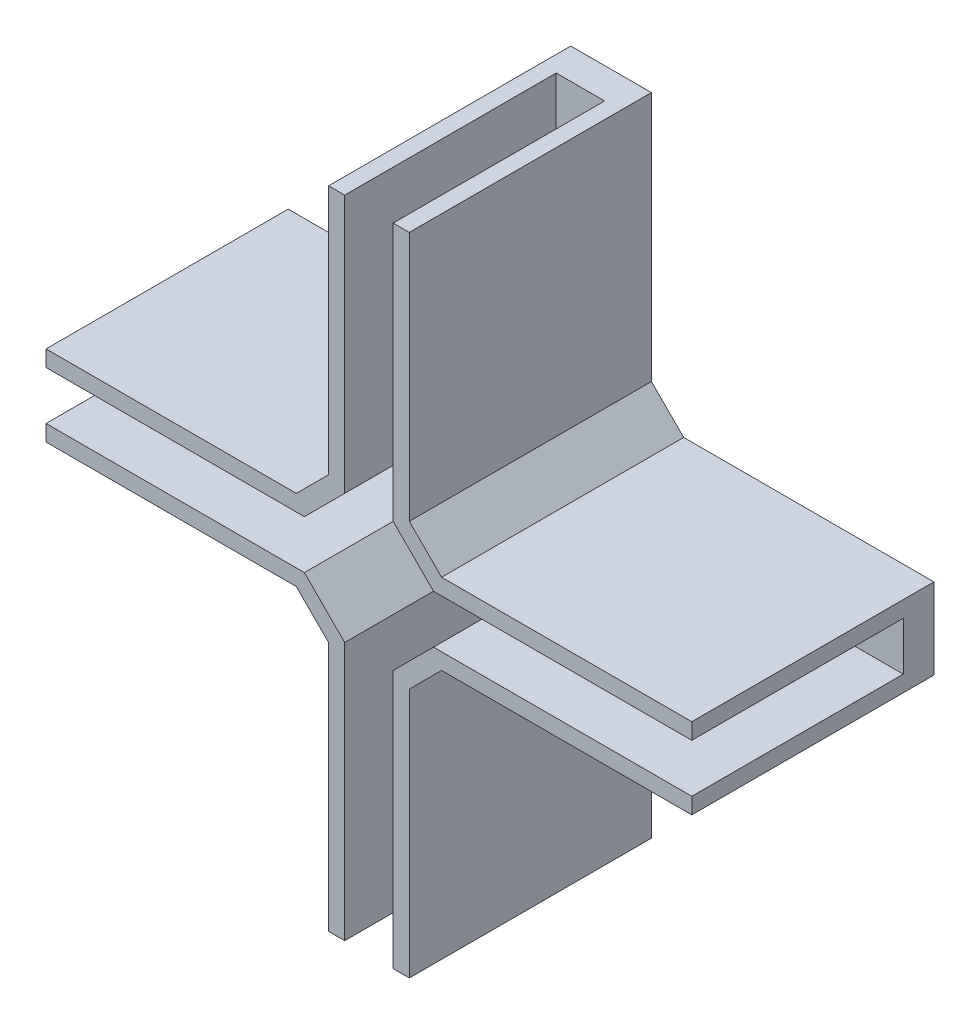
ISO-10303-21;
HEADER;
FILE_DESCRIPTION(('STEP AP214'),'2;1');
FILE_NAME('part.step','',(''),(''),'','','');
FILE_SCHEMA(('AUTOMOTIVE_DESIGN { 1 0 10303 214 1 1 1 1 }'));
ENDSEC;
DATA;
#1=APPLICATION_CONTEXT('core data for automotive mechanical design processes');
#2=APPLICATION_PROTOCOL_DEFINITION('international standard','automotive_design',2000,#1);
#3=PRODUCT_CONTEXT('',#1,'mechanical');
#4=PRODUCT('Part','Part','',(#3));
#5=PRODUCT_RELATED_PRODUCT_CATEGORY('part','',(#4));
#6=PRODUCT_DEFINITION_FORMATION('','',#4);
#7=PRODUCT_DEFINITION_CONTEXT('part definition',#1,'design');
#8=PRODUCT_DEFINITION('design','',#6,#7);
#9=PRODUCT_DEFINITION_SHAPE('','',#8);
#10=(LENGTH_UNIT() NAMED_UNIT(*) SI_UNIT(.MILLI.,.METRE.));
#11=(NAMED_UNIT(*) PLANE_ANGLE_UNIT() SI_UNIT($,.RADIAN.));
#12=(NAMED_UNIT(*) SI_UNIT($,.STERADIAN.) SOLID_ANGLE_UNIT());
#13=UNCERTAINTY_MEASURE_WITH_UNIT(LENGTH_MEASURE(1.E-05),#10,'distance_accuracy_value','');
#14=(GEOMETRIC_REPRESENTATION_CONTEXT(3) GLOBAL_UNCERTAINTY_ASSIGNED_CONTEXT((#13)) GLOBAL_UNIT_ASSIGNED_CONTEXT((#10,
#11,#12)) REPRESENTATION_CONTEXT('',''));
#15=CARTESIAN_POINT('',(0.,0.,0.));
#16=DIRECTION('',(0.,0.,1.));
#17=DIRECTION('',(1.,0.,0.));
#18=AXIS2_PLACEMENT_3D('',#15,#16,#17);
#19=CARTESIAN_POINT('',(20.,0.,15.));
#20=DIRECTION('',(-1.,0.,0.));
#21=DIRECTION('',(0.,0.,1.));
#22=AXIS2_PLACEMENT_3D('',#19,#20,#21);
#23=PLANE('',#22);
#24=DIRECTION('',(0.,0.,1.));
#25=VECTOR('',#24,1.);
#26=CARTESIAN_POINT('',(20.,-1.5,1.9));
#27=LINE('',#26,#25);
#28=CARTESIAN_POINT('',(20.,-1.5,1.9));
#29=VERTEX_POINT('',#28);
#30=CARTESIAN_POINT('',(20.,-1.5,15.));
#31=VERTEX_POINT('',#30);
#32=EDGE_CURVE('E390',#29,#31,#27,.T.);
#33=ORIENTED_EDGE('',*,*,#32,.T.);
#34=DIRECTION('',(0.,1.,0.));
#35=VECTOR('',#34,1.);
#36=CARTESIAN_POINT('',(20.,0.,15.));
#37=LINE('',#36,#35);
#38=CARTESIAN_POINT('',(20.,-2.49999999999999,15.));
#39=VERTEX_POINT('',#38);
#40=EDGE_CURVE('E346',#39,#31,#37,.T.);
#41=ORIENTED_EDGE('',*,*,#40,.F.);
#42=DIRECTION('',(0.,0.,-1.));
#43=VECTOR('',#42,1.);
#44=CARTESIAN_POINT('',(20.,-2.49999999999999,15.));
#45=LINE('',#44,#43);
#46=CARTESIAN_POINT('',(20.,-2.49999999999999,0.));
#47=VERTEX_POINT('',#46);
#48=EDGE_CURVE('E457',#39,#47,#45,.T.);
#49=ORIENTED_EDGE('',*,*,#48,.T.);
#50=DIRECTION('',(0.,1.,0.));
#51=VECTOR('',#50,1.);
#52=CARTESIAN_POINT('',(20.,0.,0.));
#53=LINE('',#52,#51);
#54=CARTESIAN_POINT('',(20.,2.50000000000001,0.));
#55=VERTEX_POINT('',#54);
#56=EDGE_CURVE('E394',#47,#55,#53,.T.);
#57=ORIENTED_EDGE('',*,*,#56,.T.);
#58=DIRECTION('',(0.,0.,-1.));
#59=VECTOR('',#58,1.);
#60=CARTESIAN_POINT('',(20.,2.50000000000001,15.));
#61=LINE('',#60,#59);
#62=CARTESIAN_POINT('',(20.,2.50000000000001,15.));
#63=VERTEX_POINT('',#62);
#64=EDGE_CURVE('E455',#63,#55,#61,.T.);
#65=ORIENTED_EDGE('',*,*,#64,.F.);
#66=CARTESIAN_POINT('',(20.,1.5,15.));
#67=VERTEX_POINT('',#66);
#68=EDGE_CURVE('E295',#67,#63,#37,.T.);
#69=ORIENTED_EDGE('',*,*,#68,.F.);
#70=DIRECTION('',(0.,0.,1.));
#71=VECTOR('',#70,1.);
#72=CARTESIAN_POINT('',(20.,1.5,1.9));
#73=LINE('',#72,#71);
#74=CARTESIAN_POINT('',(20.,1.5,1.9));
#75=VERTEX_POINT('',#74);
#76=EDGE_CURVE('E273',#75,#67,#73,.T.);
#77=ORIENTED_EDGE('',*,*,#76,.F.);
#78=DIRECTION('',(0.,1.,0.));
#79=VECTOR('',#78,1.);
#80=CARTESIAN_POINT('',(20.,-1.5,1.9));
#81=LINE('',#80,#79);
#82=EDGE_CURVE('E284',#29,#75,#81,.T.);
#83=ORIENTED_EDGE('',*,*,#82,.F.);
#84=EDGE_LOOP('',(#33,#41,#49,#57,#65,#69,#77,#83));
#85=FACE_BOUND('',#84,.T.);
#86=ADVANCED_FACE('F61',(#85),#23,.F.);
#87=CARTESIAN_POINT('',(-20.,0.,15.));
#88=DIRECTION('',(-1.,0.,0.));
#89=DIRECTION('',(0.,0.,1.));
#90=AXIS2_PLACEMENT_3D('',#87,#88,#89);
#91=PLANE('',#90);
#92=DIRECTION('',(0.,1.,0.));
#93=VECTOR('',#92,1.);
#94=CARTESIAN_POINT('',(-20.,0.,15.));
#95=LINE('',#94,#93);
#96=CARTESIAN_POINT('',(-20.,-2.49999999999999,15.));
#97=VERTEX_POINT('',#96);
#98=CARTESIAN_POINT('',(-20.,-1.5,15.));
#99=VERTEX_POINT('',#98);
#100=EDGE_CURVE('E371',#97,#99,#95,.T.);
#101=ORIENTED_EDGE('',*,*,#100,.T.);
#102=DIRECTION('',(0.,0.,1.));
#103=VECTOR('',#102,1.);
#104=CARTESIAN_POINT('',(-20.,-1.5,1.9));
#105=LINE('',#104,#103);
#106=CARTESIAN_POINT('',(-20.,-1.5,1.9));
#107=VERTEX_POINT('',#106);
#108=EDGE_CURVE('E299',#107,#99,#105,.T.);
#109=ORIENTED_EDGE('',*,*,#108,.F.);
#110=DIRECTION('',(0.,1.,0.));
#111=VECTOR('',#110,1.);
#112=CARTESIAN_POINT('',(-20.,-1.5,1.9));
#113=LINE('',#112,#111);
#114=CARTESIAN_POINT('',(-20.,1.5,1.9));
#115=VERTEX_POINT('',#114);
#116=EDGE_CURVE('E279',#107,#115,#113,.T.);
#117=ORIENTED_EDGE('',*,*,#116,.T.);
#118=DIRECTION('',(0.,0.,1.));
#119=VECTOR('',#118,1.);
#120=CARTESIAN_POINT('',(-20.,1.5,1.9));
#121=LINE('',#120,#119);
#122=CARTESIAN_POINT('',(-20.,1.5,15.));
#123=VERTEX_POINT('',#122);
#124=EDGE_CURVE('E296',#115,#123,#121,.T.);
#125=ORIENTED_EDGE('',*,*,#124,.T.);
#126=CARTESIAN_POINT('',(-20.,2.50000000000001,15.));
#127=VERTEX_POINT('',#126);
#128=EDGE_CURVE('E370',#123,#127,#95,.T.);
#129=ORIENTED_EDGE('',*,*,#128,.T.);
#130=DIRECTION('',(0.,0.,-1.));
#131=VECTOR('',#130,1.);
#132=CARTESIAN_POINT('',(-20.,2.50000000000001,15.));
#133=LINE('',#132,#131);
#134=CARTESIAN_POINT('',(-20.,2.50000000000001,0.));
#135=VERTEX_POINT('',#134);
#136=EDGE_CURVE('E440',#127,#135,#133,.T.);
#137=ORIENTED_EDGE('',*,*,#136,.T.);
#138=DIRECTION('',(0.,1.,0.));
#139=VECTOR('',#138,1.);
#140=CARTESIAN_POINT('',(-20.,0.,0.));
#141=LINE('',#140,#139);
#142=CARTESIAN_POINT('',(-20.,-2.49999999999999,0.));
#143=VERTEX_POINT('',#142);
#144=EDGE_CURVE('E417',#143,#135,#141,.T.);
#145=ORIENTED_EDGE('',*,*,#144,.F.);
#146=DIRECTION('',(0.,0.,-1.));
#147=VECTOR('',#146,1.);
#148=CARTESIAN_POINT('',(-20.,-2.49999999999999,15.));
#149=LINE('',#148,#147);
#150=EDGE_CURVE('E438',#97,#143,#149,.T.);
#151=ORIENTED_EDGE('',*,*,#150,.F.);
#152=EDGE_LOOP('',(#101,#109,#117,#125,#129,#137,#145,#151));
#153=FACE_BOUND('',#152,.T.);
#154=ADVANCED_FACE('F533',(#153),#91,.T.);
#155=CARTESIAN_POINT('',(0.,0.,15.));
#156=DIRECTION('',(0.,0.,1.));
#157=DIRECTION('',(1.,0.,0.));
#158=AXIS2_PLACEMENT_3D('',#155,#156,#157);
#159=PLANE('',#158);
#160=DIRECTION('',(-1.,0.,0.));
#161=VECTOR('',#160,1.);
#162=CARTESIAN_POINT('',(20.,1.5,15.));
#163=LINE('',#162,#161);
#164=CARTESIAN_POINT('',(-3.99999999999999,1.5,15.));
#165=VERTEX_POINT('',#164);
#166=EDGE_CURVE('E337',#165,#123,#163,.T.);
#167=ORIENTED_EDGE('',*,*,#166,.F.);
#168=DIRECTION('',(-0.707106781186546,-0.707106781186549,0.));
#169=VECTOR('',#168,1.);
#170=CARTESIAN_POINT('',(-2.75,2.74999999999999,15.));
#171=LINE('',#170,#169);
#172=CARTESIAN_POINT('',(-1.5,4.,15.));
#173=VERTEX_POINT('',#172);
#174=EDGE_CURVE('E482',#165,#173,#171,.F.);
#175=ORIENTED_EDGE('',*,*,#174,.T.);
#176=DIRECTION('',(0.,-1.,0.));
#177=VECTOR('',#176,1.);
#178=CARTESIAN_POINT('',(-1.5,20.,15.));
#179=LINE('',#178,#177);
#180=CARTESIAN_POINT('',(-1.5,20.,15.));
#181=VERTEX_POINT('',#180);
#182=EDGE_CURVE('E309',#181,#173,#179,.T.);
#183=ORIENTED_EDGE('',*,*,#182,.F.);
#184=DIRECTION('',(1.,0.,0.));
#185=VECTOR('',#184,1.);
#186=CARTESIAN_POINT('',(0.,20.,15.));
#187=LINE('',#186,#185);
#188=CARTESIAN_POINT('',(-2.5,20.,15.));
#189=VERTEX_POINT('',#188);
#190=EDGE_CURVE('E358',#189,#181,#187,.T.);
#191=ORIENTED_EDGE('',*,*,#190,.F.);
#192=DIRECTION('',(0.,1.,0.));
#193=VECTOR('',#192,1.);
#194=CARTESIAN_POINT('',(-2.5,0.,15.));
#195=LINE('',#194,#193);
#196=CARTESIAN_POINT('',(-2.5,4.50000000000001,15.));
#197=VERTEX_POINT('',#196);
#198=EDGE_CURVE('E361',#197,#189,#195,.T.);
#199=ORIENTED_EDGE('',*,*,#198,.F.);
#200=DIRECTION('',(0.707106781186548,0.707106781186547,0.));
#201=VECTOR('',#200,1.);
#202=CARTESIAN_POINT('',(-3.50000000000001,3.50000000000001,15.));
#203=LINE('',#202,#201);
#204=CARTESIAN_POINT('',(-4.5,2.50000000000001,15.));
#205=VERTEX_POINT('',#204);
#206=EDGE_CURVE('E364',#205,#197,#203,.T.);
#207=ORIENTED_EDGE('',*,*,#206,.F.);
#208=DIRECTION('',(1.,0.,0.));
#209=VECTOR('',#208,1.);
#210=CARTESIAN_POINT('',(0.,2.50000000000001,15.));
#211=LINE('',#210,#209);
#212=EDGE_CURVE('E367',#127,#205,#211,.T.);
#213=ORIENTED_EDGE('',*,*,#212,.F.);
#214=ORIENTED_EDGE('',*,*,#128,.F.);
#215=EDGE_LOOP('',(#167,#175,#183,#191,#199,#207,#213,#214));
#216=FACE_BOUND('',#215,.T.);
#217=ADVANCED_FACE('F509',(#216),#159,.T.);
#218=CARTESIAN_POINT('',(-1.5,-3.99999999999999,15.));
#219=VERTEX_POINT('',#218);
#220=CARTESIAN_POINT('',(-1.5,-20.,15.));
#221=VERTEX_POINT('',#220);
#222=EDGE_CURVE('E323',#219,#221,#179,.T.);
#223=ORIENTED_EDGE('',*,*,#222,.F.);
#224=DIRECTION('',(-0.70710678118655,0.707106781186546,0.));
#225=VECTOR('',#224,1.);
#226=CARTESIAN_POINT('',(-2.74999999999999,-2.75000000000001,15.));
#227=LINE('',#226,#225);
#228=CARTESIAN_POINT('',(-4.00000000000001,-1.5,15.));
#229=VERTEX_POINT('',#228);
#230=EDGE_CURVE('E84',#219,#229,#227,.T.);
#231=ORIENTED_EDGE('',*,*,#230,.T.);
#232=DIRECTION('',(-1.,0.,0.));
#233=VECTOR('',#232,1.);
#234=CARTESIAN_POINT('',(20.,-1.5,15.));
#235=LINE('',#234,#233);
#236=EDGE_CURVE('E540',#229,#99,#235,.T.);
#237=ORIENTED_EDGE('',*,*,#236,.T.);
#238=ORIENTED_EDGE('',*,*,#100,.F.);
#239=DIRECTION('',(1.,0.,0.));
#240=VECTOR('',#239,1.);
#241=CARTESIAN_POINT('',(0.,-2.49999999999999,15.));
#242=LINE('',#241,#240);
#243=CARTESIAN_POINT('',(-4.5,-2.49999999999999,15.));
#244=VERTEX_POINT('',#243);
#245=EDGE_CURVE('E374',#97,#244,#242,.T.);
#246=ORIENTED_EDGE('',*,*,#245,.T.);
#247=DIRECTION('',(0.707106781186548,-0.707106781186547,0.));
#248=VECTOR('',#247,1.);
#249=CARTESIAN_POINT('',(-3.5,-3.5,15.));
#250=LINE('',#249,#248);
#251=CARTESIAN_POINT('',(-2.5,-4.49999999999999,15.));
#252=VERTEX_POINT('',#251);
#253=EDGE_CURVE('E376',#244,#252,#250,.T.);
#254=ORIENTED_EDGE('',*,*,#253,.T.);
#255=DIRECTION('',(0.,1.,0.));
#256=VECTOR('',#255,1.);
#257=CARTESIAN_POINT('',(-2.5,0.,15.));
#258=LINE('',#257,#256);
#259=CARTESIAN_POINT('',(-2.5,-20.,15.));
#260=VERTEX_POINT('',#259);
#261=EDGE_CURVE('E378',#260,#252,#258,.T.);
#262=ORIENTED_EDGE('',*,*,#261,.F.);
#263=DIRECTION('',(1.,0.,0.));
#264=VECTOR('',#263,1.);
#265=CARTESIAN_POINT('',(0.,-20.,15.));
#266=LINE('',#265,#264);
#267=EDGE_CURVE('E382',#260,#221,#266,.T.);
#268=ORIENTED_EDGE('',*,*,#267,.T.);
#269=EDGE_LOOP('',(#223,#231,#237,#238,#246,#254,#262,#268));
#270=FACE_BOUND('',#269,.T.);
#271=ADVANCED_FACE('F546',(#270),#159,.T.);
#272=CARTESIAN_POINT('',(4.00000000000002,-1.5,15.));
#273=VERTEX_POINT('',#272);
#274=EDGE_CURVE('E291',#31,#273,#235,.T.);
#275=ORIENTED_EDGE('',*,*,#274,.T.);
#276=DIRECTION('',(0.707106781186547,0.707106781186548,0.));
#277=VECTOR('',#276,1.);
#278=CARTESIAN_POINT('',(2.75000000000001,-2.75,15.));
#279=LINE('',#278,#277);
#280=CARTESIAN_POINT('',(1.5,-4.00000000000001,15.));
#281=VERTEX_POINT('',#280);
#282=EDGE_CURVE('E469',#273,#281,#279,.F.);
#283=ORIENTED_EDGE('',*,*,#282,.T.);
#284=DIRECTION('',(0.,-1.,0.));
#285=VECTOR('',#284,1.);
#286=CARTESIAN_POINT('',(1.5,20.,15.));
#287=LINE('',#286,#285);
#288=CARTESIAN_POINT('',(1.5,-20.,15.));
#289=VERTEX_POINT('',#288);
#290=EDGE_CURVE('E324',#281,#289,#287,.T.);
#291=ORIENTED_EDGE('',*,*,#290,.T.);
#292=CARTESIAN_POINT('',(2.5,-20.,15.));
#293=VERTEX_POINT('',#292);
#294=EDGE_CURVE('E381',#289,#293,#266,.T.);
#295=ORIENTED_EDGE('',*,*,#294,.T.);
#296=DIRECTION('',(0.,1.,0.));
#297=VECTOR('',#296,1.);
#298=CARTESIAN_POINT('',(2.5,0.,15.));
#299=LINE('',#298,#297);
#300=CARTESIAN_POINT('',(2.5,-4.49999999999999,15.));
#301=VERTEX_POINT('',#300);
#302=EDGE_CURVE('E338',#293,#301,#299,.T.);
#303=ORIENTED_EDGE('',*,*,#302,.T.);
#304=DIRECTION('',(0.707106781186547,0.707106781186548,0.));
#305=VECTOR('',#304,1.);
#306=CARTESIAN_POINT('',(3.5,-3.49999999999999,15.));
#307=LINE('',#306,#305);
#308=CARTESIAN_POINT('',(4.5,-2.49999999999999,15.));
#309=VERTEX_POINT('',#308);
#310=EDGE_CURVE('E341',#301,#309,#307,.T.);
#311=ORIENTED_EDGE('',*,*,#310,.T.);
#312=DIRECTION('',(1.,0.,0.));
#313=VECTOR('',#312,1.);
#314=CARTESIAN_POINT('',(0.,-2.49999999999999,15.));
#315=LINE('',#314,#313);
#316=EDGE_CURVE('E344',#309,#39,#315,.T.);
#317=ORIENTED_EDGE('',*,*,#316,.T.);
#318=ORIENTED_EDGE('',*,*,#40,.T.);
#319=EDGE_LOOP('',(#275,#283,#291,#295,#303,#311,#317,#318));
#320=FACE_BOUND('',#319,.T.);
#321=ADVANCED_FACE('F588',(#320),#159,.T.);
#322=CARTESIAN_POINT('',(2.5,0.,15.));
#323=DIRECTION('',(-1.,0.,0.));
#324=DIRECTION('',(0.,-1.,0.));
#325=AXIS2_PLACEMENT_3D('',#322,#323,#324);
#326=PLANE('',#325);
#327=DIRECTION('',(0.,1.,0.));
#328=VECTOR('',#327,1.);
#329=CARTESIAN_POINT('',(2.5,0.,0.));
#330=LINE('',#329,#328);
#331=CARTESIAN_POINT('',(2.5,-20.,0.));
#332=VERTEX_POINT('',#331);
#333=CARTESIAN_POINT('',(2.5,-4.49999999999999,0.));
#334=VERTEX_POINT('',#333);
#335=EDGE_CURVE('E386',#332,#334,#330,.T.);
#336=ORIENTED_EDGE('',*,*,#335,.T.);
#337=DIRECTION('',(0.,0.,-1.));
#338=VECTOR('',#337,1.);
#339=CARTESIAN_POINT('',(2.5,-4.49999999999999,15.));
#340=LINE('',#339,#338);
#341=EDGE_CURVE('E463',#301,#334,#340,.T.);
#342=ORIENTED_EDGE('',*,*,#341,.F.);
#343=ORIENTED_EDGE('',*,*,#302,.F.);
#344=DIRECTION('',(0.,0.,-1.));
#345=VECTOR('',#344,1.);
#346=CARTESIAN_POINT('',(2.5,-20.,15.));
#347=LINE('',#346,#345);
#348=EDGE_CURVE('E385',#293,#332,#347,.T.);
#349=ORIENTED_EDGE('',*,*,#348,.T.);
#350=EDGE_LOOP('',(#336,#342,#343,#349));
#351=FACE_BOUND('',#350,.T.);
#352=ADVANCED_FACE('F622',(#351),#326,.F.);
#353=CARTESIAN_POINT('',(3.5,-3.49999999999999,15.));
#354=DIRECTION('',(-0.707106781186548,0.707106781186547,0.));
#355=DIRECTION('',(-0.707106781186547,-0.707106781186548,0.));
#356=AXIS2_PLACEMENT_3D('',#353,#354,#355);
#357=PLANE('',#356);
#358=DIRECTION('',(0.707106781186547,0.707106781186548,0.));
#359=VECTOR('',#358,1.);
#360=CARTESIAN_POINT('',(3.5,-3.49999999999999,0.));
#361=LINE('',#360,#359);
#362=CARTESIAN_POINT('',(4.5,-2.49999999999999,0.));
#363=VERTEX_POINT('',#362);
#364=EDGE_CURVE('E389',#334,#363,#361,.T.);
#365=ORIENTED_EDGE('',*,*,#364,.T.);
#366=DIRECTION('',(0.,0.,-1.));
#367=VECTOR('',#366,1.);
#368=CARTESIAN_POINT('',(4.5,-2.49999999999999,15.));
#369=LINE('',#368,#367);
#370=EDGE_CURVE('E460',#309,#363,#369,.T.);
#371=ORIENTED_EDGE('',*,*,#370,.F.);
#372=ORIENTED_EDGE('',*,*,#310,.F.);
#373=ORIENTED_EDGE('',*,*,#341,.T.);
#374=EDGE_LOOP('',(#365,#371,#372,#373));
#375=FACE_BOUND('',#374,.T.);
#376=ADVANCED_FACE('F625',(#375),#357,.F.);
#377=CARTESIAN_POINT('',(0.,-2.49999999999999,15.));
#378=DIRECTION('',(0.,1.,0.));
#379=DIRECTION('',(0.,0.,1.));
#380=AXIS2_PLACEMENT_3D('',#377,#378,#379);
#381=PLANE('',#380);
#382=DIRECTION('',(1.,0.,0.));
#383=VECTOR('',#382,1.);
#384=CARTESIAN_POINT('',(0.,-2.49999999999999,0.));
#385=LINE('',#384,#383);
#386=EDGE_CURVE('E392',#363,#47,#385,.T.);
#387=ORIENTED_EDGE('',*,*,#386,.T.);
#388=ORIENTED_EDGE('',*,*,#48,.F.);
#389=ORIENTED_EDGE('',*,*,#316,.F.);
#390=ORIENTED_EDGE('',*,*,#370,.T.);
#391=EDGE_LOOP('',(#387,#388,#389,#390));
#392=FACE_BOUND('',#391,.T.);
#393=ADVANCED_FACE('F593',(#392),#381,.F.);
#394=CARTESIAN_POINT('',(0.,2.50000000000001,15.));
#395=DIRECTION('',(0.,1.,0.));
#396=DIRECTION('',(0.,0.,1.));
#397=AXIS2_PLACEMENT_3D('',#394,#395,#396);
#398=PLANE('',#397);
#399=DIRECTION('',(1.,0.,0.));
#400=VECTOR('',#399,1.);
#401=CARTESIAN_POINT('',(0.,2.50000000000001,0.));
#402=LINE('',#401,#400);
#403=CARTESIAN_POINT('',(4.5,2.50000000000001,0.));
#404=VERTEX_POINT('',#403);
#405=EDGE_CURVE('E397',#404,#55,#402,.T.);
#406=ORIENTED_EDGE('',*,*,#405,.F.);
#407=DIRECTION('',(0.,0.,-1.));
#408=VECTOR('',#407,1.);
#409=CARTESIAN_POINT('',(4.5,2.50000000000001,15.));
#410=LINE('',#409,#408);
#411=CARTESIAN_POINT('',(4.5,2.50000000000001,15.));
#412=VERTEX_POINT('',#411);
#413=EDGE_CURVE('E453',#412,#404,#410,.T.);
#414=ORIENTED_EDGE('',*,*,#413,.F.);
#415=DIRECTION('',(1.,0.,0.));
#416=VECTOR('',#415,1.);
#417=CARTESIAN_POINT('',(0.,2.50000000000001,15.));
#418=LINE('',#417,#416);
#419=EDGE_CURVE('E349',#412,#63,#418,.T.);
#420=ORIENTED_EDGE('',*,*,#419,.T.);
#421=ORIENTED_EDGE('',*,*,#64,.T.);
#422=EDGE_LOOP('',(#406,#414,#420,#421));
#423=FACE_BOUND('',#422,.T.);
#424=ADVANCED_FACE('F603',(#423),#398,.T.);
#425=CARTESIAN_POINT('',(3.50000000000001,3.5,15.));
#426=DIRECTION('',(-0.707106781186548,-0.707106781186547,0.));
#427=DIRECTION('',(0.707106781186547,-0.707106781186548,0.));
#428=AXIS2_PLACEMENT_3D('',#425,#426,#427);
#429=PLANE('',#428);
#430=DIRECTION('',(-0.707106781186547,0.707106781186548,0.));
#431=VECTOR('',#430,1.);
#432=CARTESIAN_POINT('',(3.50000000000001,3.5,0.));
#433=LINE('',#432,#431);
#434=CARTESIAN_POINT('',(2.5,4.50000000000001,0.));
#435=VERTEX_POINT('',#434);
#436=EDGE_CURVE('E400',#404,#435,#433,.T.);
#437=ORIENTED_EDGE('',*,*,#436,.T.);
#438=DIRECTION('',(0.,0.,-1.));
#439=VECTOR('',#438,1.);
#440=CARTESIAN_POINT('',(2.5,4.50000000000001,15.));
#441=LINE('',#440,#439);
#442=CARTESIAN_POINT('',(2.5,4.50000000000001,15.));
#443=VERTEX_POINT('',#442);
#444=EDGE_CURVE('E450',#443,#435,#441,.T.);
#445=ORIENTED_EDGE('',*,*,#444,.F.);
#446=DIRECTION('',(-0.707106781186547,0.707106781186548,0.));
#447=VECTOR('',#446,1.);
#448=CARTESIAN_POINT('',(3.50000000000001,3.5,15.));
#449=LINE('',#448,#447);
#450=EDGE_CURVE('E352',#412,#443,#449,.T.);
#451=ORIENTED_EDGE('',*,*,#450,.F.);
#452=ORIENTED_EDGE('',*,*,#413,.T.);
#453=EDGE_LOOP('',(#437,#445,#451,#452));
#454=FACE_BOUND('',#453,.T.);
#455=ADVANCED_FACE('F643',(#454),#429,.F.);
#456=CARTESIAN_POINT('',(2.5,0.,15.));
#457=DIRECTION('',(-1.,0.,0.));
#458=DIRECTION('',(0.,-1.,0.));
#459=AXIS2_PLACEMENT_3D('',#456,#457,#458);
#460=PLANE('',#459);
#461=DIRECTION('',(0.,1.,0.));
#462=VECTOR('',#461,1.);
#463=CARTESIAN_POINT('',(2.5,0.,0.));
#464=LINE('',#463,#462);
#465=CARTESIAN_POINT('',(2.5,20.,0.));
#466=VERTEX_POINT('',#465);
#467=EDGE_CURVE('E402',#435,#466,#464,.T.);
#468=ORIENTED_EDGE('',*,*,#467,.T.);
#469=DIRECTION('',(0.,0.,-1.));
#470=VECTOR('',#469,1.);
#471=CARTESIAN_POINT('',(2.5,20.,15.));
#472=LINE('',#471,#470);
#473=CARTESIAN_POINT('',(2.5,20.,15.));
#474=VERTEX_POINT('',#473);
#475=EDGE_CURVE('E448',#474,#466,#472,.T.);
#476=ORIENTED_EDGE('',*,*,#475,.F.);
#477=DIRECTION('',(0.,1.,0.));
#478=VECTOR('',#477,1.);
#479=CARTESIAN_POINT('',(2.5,0.,15.));
#480=LINE('',#479,#478);
#481=EDGE_CURVE('E354',#443,#474,#480,.T.);
#482=ORIENTED_EDGE('',*,*,#481,.F.);
#483=ORIENTED_EDGE('',*,*,#444,.T.);
#484=EDGE_LOOP('',(#468,#476,#482,#483));
#485=FACE_BOUND('',#484,.T.);
#486=ADVANCED_FACE('F619',(#485),#460,.F.);
#487=CARTESIAN_POINT('',(0.,20.,15.));
#488=DIRECTION('',(0.,1.,0.));
#489=DIRECTION('',(0.,0.,1.));
#490=AXIS2_PLACEMENT_3D('',#487,#488,#489);
#491=PLANE('',#490);
#492=DIRECTION('',(0.,0.,1.));
#493=VECTOR('',#492,1.);
#494=CARTESIAN_POINT('',(-1.5,20.,1.9));
#495=LINE('',#494,#493);
#496=CARTESIAN_POINT('',(-1.5,20.,1.9));
#497=VERTEX_POINT('',#496);
#498=EDGE_CURVE('E319',#497,#181,#495,.T.);
#499=ORIENTED_EDGE('',*,*,#498,.F.);
#500=DIRECTION('',(1.,0.,0.));
#501=VECTOR('',#500,1.);
#502=CARTESIAN_POINT('',(-1.5,20.,1.9));
#503=LINE('',#502,#501);
#504=CARTESIAN_POINT('',(1.5,20.,1.9));
#505=VERTEX_POINT('',#504);
#506=EDGE_CURVE('E305',#497,#505,#503,.T.);
#507=ORIENTED_EDGE('',*,*,#506,.T.);
#508=DIRECTION('',(0.,0.,1.));
#509=VECTOR('',#508,1.);
#510=CARTESIAN_POINT('',(1.5,20.,1.9));
#511=LINE('',#510,#509);
#512=CARTESIAN_POINT('',(1.5,20.,15.));
#513=VERTEX_POINT('',#512);
#514=EDGE_CURVE('E334',#505,#513,#511,.T.);
#515=ORIENTED_EDGE('',*,*,#514,.T.);
#516=EDGE_CURVE('E357',#513,#474,#187,.T.);
#517=ORIENTED_EDGE('',*,*,#516,.T.);
#518=ORIENTED_EDGE('',*,*,#475,.T.);
#519=DIRECTION('',(1.,0.,0.));
#520=VECTOR('',#519,1.);
#521=CARTESIAN_POINT('',(0.,20.,0.));
#522=LINE('',#521,#520);
#523=CARTESIAN_POINT('',(-2.5,20.,0.));
#524=VERTEX_POINT('',#523);
#525=EDGE_CURVE('E405',#524,#466,#522,.T.);
#526=ORIENTED_EDGE('',*,*,#525,.F.);
#527=DIRECTION('',(0.,0.,-1.));
#528=VECTOR('',#527,1.);
#529=CARTESIAN_POINT('',(-2.5,20.,15.));
#530=LINE('',#529,#528);
#531=EDGE_CURVE('E446',#189,#524,#530,.T.);
#532=ORIENTED_EDGE('',*,*,#531,.F.);
#533=ORIENTED_EDGE('',*,*,#190,.T.);
#534=EDGE_LOOP('',(#499,#507,#515,#517,#518,#526,#532,#533));
#535=FACE_BOUND('',#534,.T.);
#536=ADVANCED_FACE('F516',(#535),#491,.T.);
#537=CARTESIAN_POINT('',(-2.5,0.,15.));
#538=DIRECTION('',(-1.,0.,0.));
#539=DIRECTION('',(0.,0.,1.));
#540=AXIS2_PLACEMENT_3D('',#537,#538,#539);
#541=PLANE('',#540);
#542=DIRECTION('',(0.,1.,0.));
#543=VECTOR('',#542,1.);
#544=CARTESIAN_POINT('',(-2.5,0.,0.));
#545=LINE('',#544,#543);
#546=CARTESIAN_POINT('',(-2.5,4.50000000000001,0.));
#547=VERTEX_POINT('',#546);
#548=EDGE_CURVE('E408',#547,#524,#545,.T.);
#549=ORIENTED_EDGE('',*,*,#548,.F.);
#550=DIRECTION('',(0.,0.,-1.));
#551=VECTOR('',#550,1.);
#552=CARTESIAN_POINT('',(-2.5,4.50000000000001,15.));
#553=LINE('',#552,#551);
#554=EDGE_CURVE('E444',#197,#547,#553,.T.);
#555=ORIENTED_EDGE('',*,*,#554,.F.);
#556=ORIENTED_EDGE('',*,*,#198,.T.);
#557=ORIENTED_EDGE('',*,*,#531,.T.);
#558=EDGE_LOOP('',(#549,#555,#556,#557));
#559=FACE_BOUND('',#558,.T.);
#560=ADVANCED_FACE('F522',(#559),#541,.T.);
#561=CARTESIAN_POINT('',(-3.50000000000001,3.50000000000001,15.));
#562=DIRECTION('',(-0.707106781186547,0.707106781186548,0.));
#563=DIRECTION('',(-0.707106781186548,-0.707106781186547,0.));
#564=AXIS2_PLACEMENT_3D('',#561,#562,#563);
#565=PLANE('',#564);
#566=DIRECTION('',(0.707106781186548,0.707106781186547,0.));
#567=VECTOR('',#566,1.);
#568=CARTESIAN_POINT('',(-3.50000000000001,3.50000000000001,0.));
#569=LINE('',#568,#567);
#570=CARTESIAN_POINT('',(-4.5,2.50000000000001,0.));
#571=VERTEX_POINT('',#570);
#572=EDGE_CURVE('E411',#571,#547,#569,.T.);
#573=ORIENTED_EDGE('',*,*,#572,.F.);
#574=DIRECTION('',(0.,0.,-1.));
#575=VECTOR('',#574,1.);
#576=CARTESIAN_POINT('',(-4.5,2.50000000000001,15.));
#577=LINE('',#576,#575);
#578=EDGE_CURVE('E442',#205,#571,#577,.T.);
#579=ORIENTED_EDGE('',*,*,#578,.F.);
#580=ORIENTED_EDGE('',*,*,#206,.T.);
#581=ORIENTED_EDGE('',*,*,#554,.T.);
#582=EDGE_LOOP('',(#573,#579,#580,#581));
#583=FACE_BOUND('',#582,.T.);
#584=ADVANCED_FACE('F525',(#583),#565,.T.);
#585=CARTESIAN_POINT('',(0.,2.50000000000001,15.));
#586=DIRECTION('',(0.,1.,0.));
#587=DIRECTION('',(0.,0.,1.));
#588=AXIS2_PLACEMENT_3D('',#585,#586,#587);
#589=PLANE('',#588);
#590=DIRECTION('',(1.,0.,0.));
#591=VECTOR('',#590,1.);
#592=CARTESIAN_POINT('',(0.,2.50000000000001,0.));
#593=LINE('',#592,#591);
#594=EDGE_CURVE('E414',#135,#571,#593,.T.);
#595=ORIENTED_EDGE('',*,*,#594,.F.);
#596=ORIENTED_EDGE('',*,*,#136,.F.);
#597=ORIENTED_EDGE('',*,*,#212,.T.);
#598=ORIENTED_EDGE('',*,*,#578,.T.);
#599=EDGE_LOOP('',(#595,#596,#597,#598));
#600=FACE_BOUND('',#599,.T.);
#601=ADVANCED_FACE('F530',(#600),#589,.T.);
#602=CARTESIAN_POINT('',(0.,-2.49999999999999,15.));
#603=DIRECTION('',(0.,1.,0.));
#604=DIRECTION('',(0.,0.,1.));
#605=AXIS2_PLACEMENT_3D('',#602,#603,#604);
#606=PLANE('',#605);
#607=DIRECTION('',(1.,0.,0.));
#608=VECTOR('',#607,1.);
#609=CARTESIAN_POINT('',(0.,-2.49999999999999,0.));
#610=LINE('',#609,#608);
#611=CARTESIAN_POINT('',(-4.5,-2.49999999999999,0.));
#612=VERTEX_POINT('',#611);
#613=EDGE_CURVE('E420',#143,#612,#610,.T.);
#614=ORIENTED_EDGE('',*,*,#613,.T.);
#615=DIRECTION('',(0.,0.,-1.));
#616=VECTOR('',#615,1.);
#617=CARTESIAN_POINT('',(-4.5,-2.49999999999999,15.));
#618=LINE('',#617,#616);
#619=EDGE_CURVE('E435',#244,#612,#618,.T.);
#620=ORIENTED_EDGE('',*,*,#619,.F.);
#621=ORIENTED_EDGE('',*,*,#245,.F.);
#622=ORIENTED_EDGE('',*,*,#150,.T.);
#623=EDGE_LOOP('',(#614,#620,#621,#622));
#624=FACE_BOUND('',#623,.T.);
#625=ADVANCED_FACE('F552',(#624),#606,.F.);
#626=CARTESIAN_POINT('',(-3.5,-3.5,15.));
#627=DIRECTION('',(0.707106781186547,0.707106781186548,0.));
#628=DIRECTION('',(-0.707106781186548,0.707106781186547,0.));
#629=AXIS2_PLACEMENT_3D('',#626,#627,#628);
#630=PLANE('',#629);
#631=DIRECTION('',(0.707106781186548,-0.707106781186547,0.));
#632=VECTOR('',#631,1.);
#633=CARTESIAN_POINT('',(-3.5,-3.5,0.));
#634=LINE('',#633,#632);
#635=CARTESIAN_POINT('',(-2.5,-4.49999999999999,0.));
#636=VERTEX_POINT('',#635);
#637=EDGE_CURVE('E422',#612,#636,#634,.T.);
#638=ORIENTED_EDGE('',*,*,#637,.T.);
#639=DIRECTION('',(0.,0.,-1.));
#640=VECTOR('',#639,1.);
#641=CARTESIAN_POINT('',(-2.5,-4.49999999999999,15.));
#642=LINE('',#641,#640);
#643=EDGE_CURVE('E433',#252,#636,#642,.T.);
#644=ORIENTED_EDGE('',*,*,#643,.F.);
#645=ORIENTED_EDGE('',*,*,#253,.F.);
#646=ORIENTED_EDGE('',*,*,#619,.T.);
#647=EDGE_LOOP('',(#638,#644,#645,#646));
#648=FACE_BOUND('',#647,.T.);
#649=ADVANCED_FACE('F556',(#648),#630,.F.);
#650=CARTESIAN_POINT('',(-2.5,0.,15.));
#651=DIRECTION('',(-1.,0.,0.));
#652=DIRECTION('',(0.,0.,1.));
#653=AXIS2_PLACEMENT_3D('',#650,#651,#652);
#654=PLANE('',#653);
#655=DIRECTION('',(0.,1.,0.));
#656=VECTOR('',#655,1.);
#657=CARTESIAN_POINT('',(-2.5,0.,0.));
#658=LINE('',#657,#656);
#659=CARTESIAN_POINT('',(-2.5,-20.,0.));
#660=VERTEX_POINT('',#659);
#661=EDGE_CURVE('E425',#660,#636,#658,.T.);
#662=ORIENTED_EDGE('',*,*,#661,.F.);
#663=DIRECTION('',(0.,0.,-1.));
#664=VECTOR('',#663,1.);
#665=CARTESIAN_POINT('',(-2.5,-20.,15.));
#666=LINE('',#665,#664);
#667=EDGE_CURVE('E431',#260,#660,#666,.T.);
#668=ORIENTED_EDGE('',*,*,#667,.F.);
#669=ORIENTED_EDGE('',*,*,#261,.T.);
#670=ORIENTED_EDGE('',*,*,#643,.T.);
#671=EDGE_LOOP('',(#662,#668,#669,#670));
#672=FACE_BOUND('',#671,.T.);
#673=ADVANCED_FACE('F559',(#672),#654,.T.);
#674=CARTESIAN_POINT('',(0.,-20.,15.));
#675=DIRECTION('',(0.,1.,0.));
#676=DIRECTION('',(0.,0.,1.));
#677=AXIS2_PLACEMENT_3D('',#674,#675,#676);
#678=PLANE('',#677);
#679=DIRECTION('',(1.,0.,0.));
#680=VECTOR('',#679,1.);
#681=CARTESIAN_POINT('',(-1.5,-20.,1.9));
#682=LINE('',#681,#680);
#683=CARTESIAN_POINT('',(-1.5,-20.,1.9));
#684=VERTEX_POINT('',#683);
#685=CARTESIAN_POINT('',(1.5,-20.,1.9));
#686=VERTEX_POINT('',#685);
#687=EDGE_CURVE('E313',#684,#686,#682,.T.);
#688=ORIENTED_EDGE('',*,*,#687,.F.);
#689=DIRECTION('',(0.,0.,1.));
#690=VECTOR('',#689,1.);
#691=CARTESIAN_POINT('',(-1.5,-20.,1.9));
#692=LINE('',#691,#690);
#693=EDGE_CURVE('E328',#684,#221,#692,.T.);
#694=ORIENTED_EDGE('',*,*,#693,.T.);
#695=ORIENTED_EDGE('',*,*,#267,.F.);
#696=ORIENTED_EDGE('',*,*,#667,.T.);
#697=DIRECTION('',(1.,0.,0.));
#698=VECTOR('',#697,1.);
#699=CARTESIAN_POINT('',(0.,-20.,0.));
#700=LINE('',#699,#698);
#701=EDGE_CURVE('E342',#660,#332,#700,.T.);
#702=ORIENTED_EDGE('',*,*,#701,.T.);
#703=ORIENTED_EDGE('',*,*,#348,.F.);
#704=ORIENTED_EDGE('',*,*,#294,.F.);
#705=DIRECTION('',(0.,0.,1.));
#706=VECTOR('',#705,1.);
#707=CARTESIAN_POINT('',(1.5,-20.,1.9));
#708=LINE('',#707,#706);
#709=EDGE_CURVE('E331',#686,#289,#708,.T.);
#710=ORIENTED_EDGE('',*,*,#709,.F.);
#711=EDGE_LOOP('',(#688,#694,#695,#696,#702,#703,#704,#710));
#712=FACE_BOUND('',#711,.T.);
#713=ADVANCED_FACE('F563',(#712),#678,.F.);
#714=CARTESIAN_POINT('',(1.5,4.00000000000001,15.));
#715=VERTEX_POINT('',#714);
#716=EDGE_CURVE('E320',#513,#715,#287,.T.);
#717=ORIENTED_EDGE('',*,*,#716,.T.);
#718=DIRECTION('',(0.707106781186549,-0.707106781186546,0.));
#719=VECTOR('',#718,1.);
#720=CARTESIAN_POINT('',(2.75,2.75000000000001,15.));
#721=LINE('',#720,#719);
#722=CARTESIAN_POINT('',(4.00000000000002,1.5,15.));
#723=VERTEX_POINT('',#722);
#724=EDGE_CURVE('E476',#715,#723,#721,.T.);
#725=ORIENTED_EDGE('',*,*,#724,.T.);
#726=EDGE_CURVE('E538',#67,#723,#163,.T.);
#727=ORIENTED_EDGE('',*,*,#726,.F.);
#728=ORIENTED_EDGE('',*,*,#68,.T.);
#729=ORIENTED_EDGE('',*,*,#419,.F.);
#730=ORIENTED_EDGE('',*,*,#450,.T.);
#731=ORIENTED_EDGE('',*,*,#481,.T.);
#732=ORIENTED_EDGE('',*,*,#516,.F.);
#733=EDGE_LOOP('',(#717,#725,#727,#728,#729,#730,#731,#732));
#734=FACE_BOUND('',#733,.T.);
#735=ADVANCED_FACE('F607',(#734),#159,.T.);
#736=CARTESIAN_POINT('',(0.,0.,0.));
#737=DIRECTION('',(0.,0.,1.));
#738=DIRECTION('',(1.,0.,0.));
#739=AXIS2_PLACEMENT_3D('',#736,#737,#738);
#740=PLANE('',#739);
#741=ORIENTED_EDGE('',*,*,#335,.F.);
#742=ORIENTED_EDGE('',*,*,#701,.F.);
#743=ORIENTED_EDGE('',*,*,#661,.T.);
#744=ORIENTED_EDGE('',*,*,#637,.F.);
#745=ORIENTED_EDGE('',*,*,#613,.F.);
#746=ORIENTED_EDGE('',*,*,#144,.T.);
#747=ORIENTED_EDGE('',*,*,#594,.T.);
#748=ORIENTED_EDGE('',*,*,#572,.T.);
#749=ORIENTED_EDGE('',*,*,#548,.T.);
#750=ORIENTED_EDGE('',*,*,#525,.T.);
#751=ORIENTED_EDGE('',*,*,#467,.F.);
#752=ORIENTED_EDGE('',*,*,#436,.F.);
#753=ORIENTED_EDGE('',*,*,#405,.T.);
#754=ORIENTED_EDGE('',*,*,#56,.F.);
#755=ORIENTED_EDGE('',*,*,#386,.F.);
#756=ORIENTED_EDGE('',*,*,#364,.F.);
#757=EDGE_LOOP('',(#741,#742,#743,#744,#745,#746,#747,#748,#749,#750,#751,#752,#753,#754,#755,#756));
#758=FACE_BOUND('',#757,.T.);
#759=ADVANCED_FACE('F598',(#758),#740,.F.);
#760=CARTESIAN_POINT('',(20.,-1.5,1.9));
#761=DIRECTION('',(0.,1.,0.));
#762=DIRECTION('',(0.,0.,1.));
#763=AXIS2_PLACEMENT_3D('',#760,#761,#762);
#764=PLANE('',#763);
#765=ORIENTED_EDGE('',*,*,#236,.F.);
#766=DIRECTION('',(0.,0.,-1.));
#767=VECTOR('',#766,1.);
#768=CARTESIAN_POINT('',(-4.00000000000001,-1.5,1.9));
#769=LINE('',#768,#767);
#770=CARTESIAN_POINT('',(-4.00000000000001,-1.5,1.9));
#771=VERTEX_POINT('',#770);
#772=EDGE_CURVE('E76',#229,#771,#769,.T.);
#773=ORIENTED_EDGE('',*,*,#772,.T.);
#774=DIRECTION('',(-1.,0.,0.));
#775=VECTOR('',#774,1.);
#776=CARTESIAN_POINT('',(20.,-1.5,1.9));
#777=LINE('',#776,#775);
#778=EDGE_CURVE('E301',#771,#107,#777,.T.);
#779=ORIENTED_EDGE('',*,*,#778,.T.);
#780=ORIENTED_EDGE('',*,*,#108,.T.);
#781=EDGE_LOOP('',(#765,#773,#779,#780));
#782=FACE_BOUND('',#781,.T.);
#783=ADVANCED_FACE('F543',(#782),#764,.T.);
#784=CARTESIAN_POINT('',(20.,1.5,1.9));
#785=DIRECTION('',(0.,1.,0.));
#786=DIRECTION('',(0.,0.,1.));
#787=AXIS2_PLACEMENT_3D('',#784,#785,#786);
#788=PLANE('',#787);
#789=DIRECTION('',(-1.,0.,0.));
#790=VECTOR('',#789,1.);
#791=CARTESIAN_POINT('',(20.,1.5,1.9));
#792=LINE('',#791,#790);
#793=CARTESIAN_POINT('',(-3.99999999999999,1.5,1.9));
#794=VERTEX_POINT('',#793);
#795=EDGE_CURVE('E280',#794,#115,#792,.T.);
#796=ORIENTED_EDGE('',*,*,#795,.F.);
#797=DIRECTION('',(0.,0.,1.));
#798=VECTOR('',#797,1.);
#799=CARTESIAN_POINT('',(-3.99999999999999,1.5,1.9));
#800=LINE('',#799,#798);
#801=EDGE_CURVE('E479',#794,#165,#800,.T.);
#802=ORIENTED_EDGE('',*,*,#801,.T.);
#803=ORIENTED_EDGE('',*,*,#166,.T.);
#804=ORIENTED_EDGE('',*,*,#124,.F.);
#805=EDGE_LOOP('',(#796,#802,#803,#804));
#806=FACE_BOUND('',#805,.T.);
#807=ADVANCED_FACE('F503',(#806),#788,.F.);
#808=CARTESIAN_POINT('',(0.,0.,1.9));
#809=DIRECTION('',(0.,0.,1.));
#810=DIRECTION('',(1.,0.,0.));
#811=AXIS2_PLACEMENT_3D('',#808,#809,#810);
#812=PLANE('',#811);
#813=DIRECTION('',(0.,-1.,0.));
#814=VECTOR('',#813,1.);
#815=CARTESIAN_POINT('',(-1.5,20.,1.9));
#816=LINE('',#815,#814);
#817=CARTESIAN_POINT('',(-1.5,4.,1.9));
#818=VERTEX_POINT('',#817);
#819=EDGE_CURVE('E317',#497,#818,#816,.T.);
#820=ORIENTED_EDGE('',*,*,#819,.T.);
#821=DIRECTION('',(0.707106781186546,0.707106781186549,0.));
#822=VECTOR('',#821,1.);
#823=CARTESIAN_POINT('',(-3.99999999999999,1.5,1.9));
#824=LINE('',#823,#822);
#825=EDGE_CURVE('E69',#818,#794,#824,.F.);
#826=ORIENTED_EDGE('',*,*,#825,.T.);
#827=ORIENTED_EDGE('',*,*,#795,.T.);
#828=ORIENTED_EDGE('',*,*,#116,.F.);
#829=ORIENTED_EDGE('',*,*,#778,.F.);
#830=DIRECTION('',(0.70710678118655,-0.707106781186546,0.));
#831=VECTOR('',#830,1.);
#832=CARTESIAN_POINT('',(-1.5,-3.99999999999999,1.9));
#833=LINE('',#832,#831);
#834=CARTESIAN_POINT('',(-1.5,-3.99999999999999,1.9));
#835=VERTEX_POINT('',#834);
#836=EDGE_CURVE('E12',#771,#835,#833,.T.);
#837=ORIENTED_EDGE('',*,*,#836,.T.);
#838=EDGE_CURVE('E316',#835,#684,#816,.T.);
#839=ORIENTED_EDGE('',*,*,#838,.T.);
#840=ORIENTED_EDGE('',*,*,#687,.T.);
#841=DIRECTION('',(0.,-1.,0.));
#842=VECTOR('',#841,1.);
#843=CARTESIAN_POINT('',(1.5,20.,1.9));
#844=LINE('',#843,#842);
#845=CARTESIAN_POINT('',(1.5,-4.00000000000001,1.9));
#846=VERTEX_POINT('',#845);
#847=EDGE_CURVE('E308',#846,#686,#844,.T.);
#848=ORIENTED_EDGE('',*,*,#847,.F.);
#849=DIRECTION('',(-0.707106781186547,-0.707106781186548,0.));
#850=VECTOR('',#849,1.);
#851=CARTESIAN_POINT('',(4.00000000000001,-1.5,1.9));
#852=LINE('',#851,#850);
#853=CARTESIAN_POINT('',(4.00000000000001,-1.5,1.9));
#854=VERTEX_POINT('',#853);
#855=EDGE_CURVE('E491',#846,#854,#852,.F.);
#856=ORIENTED_EDGE('',*,*,#855,.T.);
#857=EDGE_CURVE('E288',#29,#854,#777,.T.);
#858=ORIENTED_EDGE('',*,*,#857,.F.);
#859=ORIENTED_EDGE('',*,*,#82,.T.);
#860=CARTESIAN_POINT('',(4.00000000000002,1.5,1.9));
#861=VERTEX_POINT('',#860);
#862=EDGE_CURVE('E268',#75,#861,#792,.T.);
#863=ORIENTED_EDGE('',*,*,#862,.T.);
#864=DIRECTION('',(-0.707106781186549,0.707106781186546,0.));
#865=VECTOR('',#864,1.);
#866=CARTESIAN_POINT('',(1.5,4.,1.9));
#867=LINE('',#866,#865);
#868=CARTESIAN_POINT('',(1.5,4.,1.9));
#869=VERTEX_POINT('',#868);
#870=EDGE_CURVE('E493',#861,#869,#867,.T.);
#871=ORIENTED_EDGE('',*,*,#870,.T.);
#872=EDGE_CURVE('E310',#505,#869,#844,.T.);
#873=ORIENTED_EDGE('',*,*,#872,.F.);
#874=ORIENTED_EDGE('',*,*,#506,.F.);
#875=EDGE_LOOP('',(#820,#826,#827,#828,#829,#837,#839,#840,#848,#856,#858,#859,#863,#871,#873,#874));
#876=FACE_BOUND('',#875,.T.);
#877=ADVANCED_FACE('F286',(#876),#812,.T.);
#878=ORIENTED_EDGE('',*,*,#857,.T.);
#879=DIRECTION('',(0.,0.,1.));
#880=VECTOR('',#879,1.);
#881=CARTESIAN_POINT('',(4.00000000000001,-1.5,1.9));
#882=LINE('',#881,#880);
#883=EDGE_CURVE('E466',#854,#273,#882,.T.);
#884=ORIENTED_EDGE('',*,*,#883,.T.);
#885=ORIENTED_EDGE('',*,*,#274,.F.);
#886=ORIENTED_EDGE('',*,*,#32,.F.);
#887=EDGE_LOOP('',(#878,#884,#885,#886));
#888=FACE_BOUND('',#887,.T.);
#889=ADVANCED_FACE('F585',(#888),#764,.T.);
#890=ORIENTED_EDGE('',*,*,#726,.T.);
#891=DIRECTION('',(0.,0.,-1.));
#892=VECTOR('',#891,1.);
#893=CARTESIAN_POINT('',(4.00000000000002,1.5,1.9));
#894=LINE('',#893,#892);
#895=EDGE_CURVE('E276',#723,#861,#894,.T.);
#896=ORIENTED_EDGE('',*,*,#895,.T.);
#897=ORIENTED_EDGE('',*,*,#862,.F.);
#898=ORIENTED_EDGE('',*,*,#76,.T.);
#899=EDGE_LOOP('',(#890,#896,#897,#898));
#900=FACE_BOUND('',#899,.T.);
#901=ADVANCED_FACE('F271',(#900),#788,.F.);
#902=CARTESIAN_POINT('',(-1.5,20.,1.9));
#903=DIRECTION('',(-1.,0.,0.));
#904=DIRECTION('',(0.,0.,1.));
#905=AXIS2_PLACEMENT_3D('',#902,#903,#904);
#906=PLANE('',#905);
#907=ORIENTED_EDGE('',*,*,#182,.T.);
#908=DIRECTION('',(0.,0.,-1.));
#909=VECTOR('',#908,1.);
#910=CARTESIAN_POINT('',(-1.5,4.,1.9));
#911=LINE('',#910,#909);
#912=EDGE_CURVE('E484',#173,#818,#911,.T.);
#913=ORIENTED_EDGE('',*,*,#912,.T.);
#914=ORIENTED_EDGE('',*,*,#819,.F.);
#915=ORIENTED_EDGE('',*,*,#498,.T.);
#916=EDGE_LOOP('',(#907,#913,#914,#915));
#917=FACE_BOUND('',#916,.T.);
#918=ADVANCED_FACE('F513',(#917),#906,.F.);
#919=CARTESIAN_POINT('',(1.5,20.,1.9));
#920=DIRECTION('',(-1.,0.,0.));
#921=DIRECTION('',(0.,0.,1.));
#922=AXIS2_PLACEMENT_3D('',#919,#920,#921);
#923=PLANE('',#922);
#924=ORIENTED_EDGE('',*,*,#872,.T.);
#925=DIRECTION('',(0.,0.,1.));
#926=VECTOR('',#925,1.);
#927=CARTESIAN_POINT('',(1.5,4.,15.));
#928=LINE('',#927,#926);
#929=EDGE_CURVE('E473',#869,#715,#928,.T.);
#930=ORIENTED_EDGE('',*,*,#929,.T.);
#931=ORIENTED_EDGE('',*,*,#716,.F.);
#932=ORIENTED_EDGE('',*,*,#514,.F.);
#933=EDGE_LOOP('',(#924,#930,#931,#932));
#934=FACE_BOUND('',#933,.T.);
#935=ADVANCED_FACE('F614',(#934),#923,.T.);
#936=ORIENTED_EDGE('',*,*,#838,.F.);
#937=DIRECTION('',(0.,0.,1.));
#938=VECTOR('',#937,1.);
#939=CARTESIAN_POINT('',(-1.5,-3.99999999999999,15.));
#940=LINE('',#939,#938);
#941=EDGE_CURVE('E486',#835,#219,#940,.T.);
#942=ORIENTED_EDGE('',*,*,#941,.T.);
#943=ORIENTED_EDGE('',*,*,#222,.T.);
#944=ORIENTED_EDGE('',*,*,#693,.F.);
#945=EDGE_LOOP('',(#936,#942,#943,#944));
#946=FACE_BOUND('',#945,.T.);
#947=ADVANCED_FACE('F569',(#946),#906,.F.);
#948=ORIENTED_EDGE('',*,*,#290,.F.);
#949=DIRECTION('',(0.,0.,-1.));
#950=VECTOR('',#949,1.);
#951=CARTESIAN_POINT('',(1.5,-4.00000000000001,1.9));
#952=LINE('',#951,#950);
#953=EDGE_CURVE('E471',#281,#846,#952,.T.);
#954=ORIENTED_EDGE('',*,*,#953,.T.);
#955=ORIENTED_EDGE('',*,*,#847,.T.);
#956=ORIENTED_EDGE('',*,*,#709,.T.);
#957=EDGE_LOOP('',(#948,#954,#955,#956));
#958=FACE_BOUND('',#957,.T.);
#959=ADVANCED_FACE('F579',(#958),#923,.T.);
#960=CARTESIAN_POINT('',(4.00000000000001,-1.5,1.9));
#961=DIRECTION('',(0.707106781186548,-0.707106781186547,0.));
#962=DIRECTION('',(0.,0.,1.));
#963=AXIS2_PLACEMENT_3D('',#960,#961,#962);
#964=PLANE('',#963);
#965=ORIENTED_EDGE('',*,*,#855,.F.);
#966=ORIENTED_EDGE('',*,*,#953,.F.);
#967=ORIENTED_EDGE('',*,*,#282,.F.);
#968=ORIENTED_EDGE('',*,*,#883,.F.);
#969=EDGE_LOOP('',(#965,#966,#967,#968));
#970=FACE_BOUND('',#969,.T.);
#971=ADVANCED_FACE('F582',(#970),#964,.F.);
#972=CARTESIAN_POINT('',(1.5,4.,1.9));
#973=DIRECTION('',(-0.707106781186546,-0.707106781186549,0.));
#974=DIRECTION('',(0.,0.,-1.));
#975=AXIS2_PLACEMENT_3D('',#972,#973,#974);
#976=PLANE('',#975);
#977=ORIENTED_EDGE('',*,*,#870,.F.);
#978=ORIENTED_EDGE('',*,*,#895,.F.);
#979=ORIENTED_EDGE('',*,*,#724,.F.);
#980=ORIENTED_EDGE('',*,*,#929,.F.);
#981=EDGE_LOOP('',(#977,#978,#979,#980));
#982=FACE_BOUND('',#981,.T.);
#983=ADVANCED_FACE('F610',(#982),#976,.T.);
#984=CARTESIAN_POINT('',(-3.99999999999999,1.5,1.9));
#985=DIRECTION('',(-0.707106781186549,0.707106781186546,0.));
#986=DIRECTION('',(0.,0.,1.));
#987=AXIS2_PLACEMENT_3D('',#984,#985,#986);
#988=PLANE('',#987);
#989=ORIENTED_EDGE('',*,*,#825,.F.);
#990=ORIENTED_EDGE('',*,*,#912,.F.);
#991=ORIENTED_EDGE('',*,*,#174,.F.);
#992=ORIENTED_EDGE('',*,*,#801,.F.);
#993=EDGE_LOOP('',(#989,#990,#991,#992));
#994=FACE_BOUND('',#993,.T.);
#995=ADVANCED_FACE('F506',(#994),#988,.F.);
#996=CARTESIAN_POINT('',(-1.5,-3.99999999999999,1.9));
#997=DIRECTION('',(0.707106781186545,0.707106781186549,0.));
#998=DIRECTION('',(0.,0.,-1.));
#999=AXIS2_PLACEMENT_3D('',#996,#997,#998);
#1000=PLANE('',#999);
#1001=ORIENTED_EDGE('',*,*,#836,.F.);
#1002=ORIENTED_EDGE('',*,*,#772,.F.);
#1003=ORIENTED_EDGE('',*,*,#230,.F.);
#1004=ORIENTED_EDGE('',*,*,#941,.F.);
#1005=EDGE_LOOP('',(#1001,#1002,#1003,#1004));
#1006=FACE_BOUND('',#1005,.T.);
#1007=ADVANCED_FACE('F63',(#1006),#1000,.T.);
#1008=CLOSED_SHELL('',(#86,#154,#217,#271,#321,#352,#376,#393,#424,#455,#486,#536,#560,#584,
#601,#625,#649,#673,#713,#735,#759,#783,#807,#877,#889,#901,#918,#935,#947,#959,#971,#983,#995,#1007));
#1009=MANIFOLD_SOLID_BREP('B2',#1008);
#1010=ADVANCED_BREP_SHAPE_REPRESENTATION('',(#18,#1009),#14);
#1011=SHAPE_DEFINITION_REPRESENTATION(#9,#1010);
ENDSEC;
END-ISO-10303-21;
